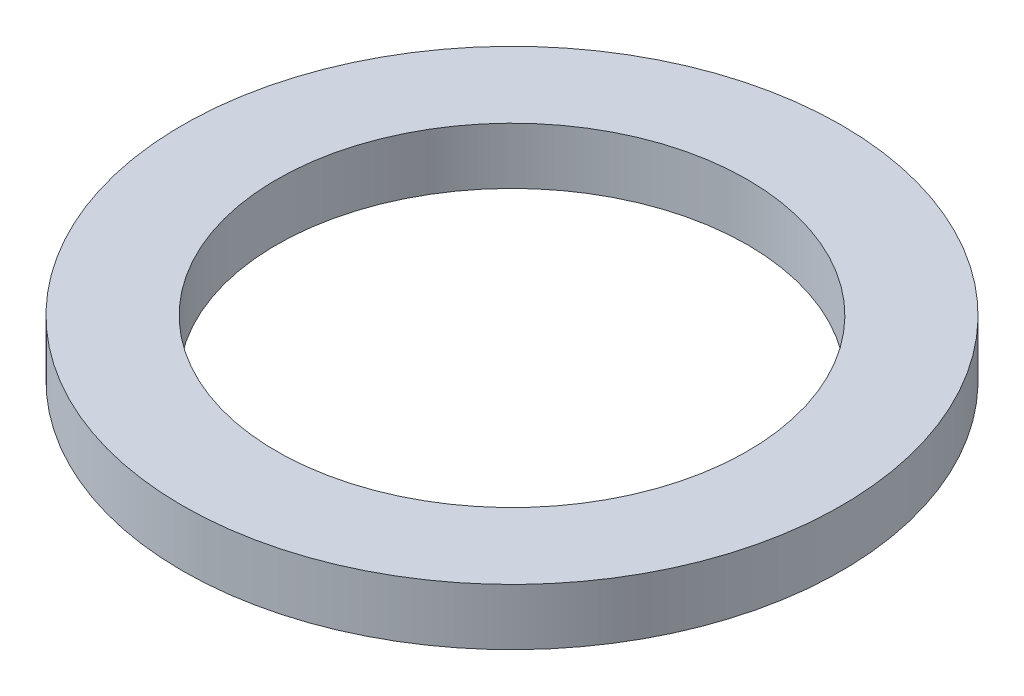
ISO-10303-21;
HEADER;
FILE_DESCRIPTION(('STEP AP214'),'2;1');
FILE_NAME('part.step','',(''),(''),'','','');
FILE_SCHEMA(('AUTOMOTIVE_DESIGN { 1 0 10303 214 1 1 1 1 }'));
ENDSEC;
DATA;
#1=APPLICATION_CONTEXT('core data for automotive mechanical design processes');
#2=APPLICATION_PROTOCOL_DEFINITION('international standard','automotive_design',2000,#1);
#3=PRODUCT_CONTEXT('',#1,'mechanical');
#4=PRODUCT('Part','Part','',(#3));
#5=PRODUCT_RELATED_PRODUCT_CATEGORY('part','',(#4));
#6=PRODUCT_DEFINITION_FORMATION('','',#4);
#7=PRODUCT_DEFINITION_CONTEXT('part definition',#1,'design');
#8=PRODUCT_DEFINITION('design','',#6,#7);
#9=PRODUCT_DEFINITION_SHAPE('','',#8);
#10=(LENGTH_UNIT() NAMED_UNIT(*) SI_UNIT(.MILLI.,.METRE.));
#11=(NAMED_UNIT(*) PLANE_ANGLE_UNIT() SI_UNIT($,.RADIAN.));
#12=(NAMED_UNIT(*) SI_UNIT($,.STERADIAN.) SOLID_ANGLE_UNIT());
#13=UNCERTAINTY_MEASURE_WITH_UNIT(LENGTH_MEASURE(1.E-05),#10,'distance_accuracy_value','');
#14=(GEOMETRIC_REPRESENTATION_CONTEXT(3) GLOBAL_UNCERTAINTY_ASSIGNED_CONTEXT((#13)) GLOBAL_UNIT_ASSIGNED_CONTEXT((#10,
#11,#12)) REPRESENTATION_CONTEXT('',''));
#15=CARTESIAN_POINT('',(0.,0.,0.));
#16=DIRECTION('',(0.,0.,1.));
#17=DIRECTION('',(1.,0.,0.));
#18=AXIS2_PLACEMENT_3D('',#15,#16,#17);
#19=CARTESIAN_POINT('',(0.,3.81,0.));
#20=DIRECTION('',(0.,1.,0.));
#21=DIRECTION('',(0.,0.,1.));
#22=AXIS2_PLACEMENT_3D('',#19,#20,#21);
#23=PLANE('',#22);
#24=CARTESIAN_POINT('',(0.,3.81,0.));
#25=DIRECTION('',(0.,1.,0.));
#26=DIRECTION('',(0.,0.,1.));
#27=AXIS2_PLACEMENT_3D('',#24,#25,#26);
#28=CIRCLE('',#27,22.225);
#29=CARTESIAN_POINT('',(0.,3.81,-22.225));
#30=VERTEX_POINT('',#29);
#31=EDGE_CURVE('E10',#30,#30,#28,.T.);
#32=ORIENTED_EDGE('',*,*,#31,.T.);
#33=EDGE_LOOP('',(#32));
#34=FACE_BOUND('',#33,.T.);
#35=CARTESIAN_POINT('',(0.,3.81,0.));
#36=DIRECTION('',(0.,1.,0.));
#37=DIRECTION('',(0.,0.,1.));
#38=AXIS2_PLACEMENT_3D('',#35,#36,#37);
#39=CIRCLE('',#38,15.875);
#40=CARTESIAN_POINT('',(0.,3.81,-15.875));
#41=VERTEX_POINT('',#40);
#42=EDGE_CURVE('E41',#41,#41,#39,.T.);
#43=ORIENTED_EDGE('',*,*,#42,.F.);
#44=EDGE_LOOP('',(#43));
#45=FACE_BOUND('',#44,.T.);
#46=ADVANCED_FACE('F30',(#34,#45),#23,.T.);
#47=CARTESIAN_POINT('',(0.,0.,0.));
#48=DIRECTION('',(0.,1.,0.));
#49=DIRECTION('',(0.,0.,1.));
#50=AXIS2_PLACEMENT_3D('',#47,#48,#49);
#51=PLANE('',#50);
#52=CARTESIAN_POINT('',(0.,0.,0.));
#53=DIRECTION('',(0.,1.,0.));
#54=DIRECTION('',(0.,0.,1.));
#55=AXIS2_PLACEMENT_3D('',#52,#53,#54);
#56=CIRCLE('',#55,22.225);
#57=CARTESIAN_POINT('',(0.,0.,-22.225));
#58=VERTEX_POINT('',#57);
#59=EDGE_CURVE('E34',#58,#58,#56,.T.);
#60=ORIENTED_EDGE('',*,*,#59,.F.);
#61=EDGE_LOOP('',(#60));
#62=FACE_BOUND('',#61,.T.);
#63=CARTESIAN_POINT('',(0.,0.,0.));
#64=DIRECTION('',(0.,1.,0.));
#65=DIRECTION('',(0.,0.,1.));
#66=AXIS2_PLACEMENT_3D('',#63,#64,#65);
#67=CIRCLE('',#66,15.875);
#68=CARTESIAN_POINT('',(0.,0.,-15.875));
#69=VERTEX_POINT('',#68);
#70=EDGE_CURVE('E43',#69,#69,#67,.T.);
#71=ORIENTED_EDGE('',*,*,#70,.T.);
#72=EDGE_LOOP('',(#71));
#73=FACE_BOUND('',#72,.T.);
#74=ADVANCED_FACE('F53',(#62,#73),#51,.F.);
#75=CARTESIAN_POINT('',(0.,3.81,0.));
#76=DIRECTION('',(0.,-1.,0.));
#77=DIRECTION('',(0.,0.,-1.));
#78=AXIS2_PLACEMENT_3D('',#75,#76,#77);
#79=CYLINDRICAL_SURFACE('',#78,22.225);
#80=CARTESIAN_POINT('',(0.,3.81,-22.225));
#81=CARTESIAN_POINT('',(0.,3.7703125,-22.225));
#82=CARTESIAN_POINT('',(0.,3.730625,-22.225));
#83=CARTESIAN_POINT('',(0.,3.65125,-22.225));
#84=CARTESIAN_POINT('',(0.,3.6115625,-22.225));
#85=CARTESIAN_POINT('',(0.,3.5321875,-22.225));
#86=CARTESIAN_POINT('',(0.,3.4925,-22.225));
#87=CARTESIAN_POINT('',(0.,3.413125,-22.225));
#88=CARTESIAN_POINT('',(0.,3.3734375,-22.225));
#89=CARTESIAN_POINT('',(0.,3.2940625,-22.225));
#90=CARTESIAN_POINT('',(0.,3.254375,-22.225));
#91=CARTESIAN_POINT('',(0.,3.175,-22.225));
#92=CARTESIAN_POINT('',(0.,3.1353125,-22.225));
#93=CARTESIAN_POINT('',(0.,3.0559375,-22.225));
#94=CARTESIAN_POINT('',(0.,3.01625,-22.225));
#95=CARTESIAN_POINT('',(0.,2.936875,-22.225));
#96=CARTESIAN_POINT('',(0.,2.8971875,-22.225));
#97=CARTESIAN_POINT('',(0.,2.8178125,-22.225));
#98=CARTESIAN_POINT('',(0.,2.778125,-22.225));
#99=CARTESIAN_POINT('',(0.,2.69875,-22.225));
#100=CARTESIAN_POINT('',(0.,2.6590625,-22.225));
#101=CARTESIAN_POINT('',(0.,2.5796875,-22.225));
#102=CARTESIAN_POINT('',(0.,2.54,-22.225));
#103=CARTESIAN_POINT('',(0.,2.460625,-22.225));
#104=CARTESIAN_POINT('',(0.,2.4209375,-22.225));
#105=CARTESIAN_POINT('',(0.,2.3415625,-22.225));
#106=CARTESIAN_POINT('',(0.,2.301875,-22.225));
#107=CARTESIAN_POINT('',(0.,2.2225,-22.225));
#108=CARTESIAN_POINT('',(0.,2.1828125,-22.225));
#109=CARTESIAN_POINT('',(0.,2.1034375,-22.225));
#110=CARTESIAN_POINT('',(0.,2.06375,-22.225));
#111=CARTESIAN_POINT('',(0.,1.984375,-22.225));
#112=CARTESIAN_POINT('',(0.,1.9446875,-22.225));
#113=CARTESIAN_POINT('',(0.,1.8653125,-22.225));
#114=CARTESIAN_POINT('',(0.,1.825625,-22.225));
#115=CARTESIAN_POINT('',(0.,1.74625,-22.225));
#116=CARTESIAN_POINT('',(0.,1.7065625,-22.225));
#117=CARTESIAN_POINT('',(0.,1.6271875,-22.225));
#118=CARTESIAN_POINT('',(0.,1.5875,-22.225));
#119=CARTESIAN_POINT('',(0.,1.508125,-22.225));
#120=CARTESIAN_POINT('',(0.,1.4684375,-22.225));
#121=CARTESIAN_POINT('',(0.,1.3890625,-22.225));
#122=CARTESIAN_POINT('',(0.,1.349375,-22.225));
#123=CARTESIAN_POINT('',(0.,1.27,-22.225));
#124=CARTESIAN_POINT('',(0.,1.2303125,-22.225));
#125=CARTESIAN_POINT('',(0.,1.1509375,-22.225));
#126=CARTESIAN_POINT('',(0.,1.11125,-22.225));
#127=CARTESIAN_POINT('',(0.,1.031875,-22.225));
#128=CARTESIAN_POINT('',(0.,0.9921875,-22.225));
#129=CARTESIAN_POINT('',(0.,0.9128125,-22.225));
#130=CARTESIAN_POINT('',(0.,0.873125,-22.225));
#131=CARTESIAN_POINT('',(0.,0.79375,-22.225));
#132=CARTESIAN_POINT('',(0.,0.7540625,-22.225));
#133=CARTESIAN_POINT('',(0.,0.6746875,-22.225));
#134=CARTESIAN_POINT('',(0.,0.635,-22.225));
#135=CARTESIAN_POINT('',(0.,0.555625,-22.225));
#136=CARTESIAN_POINT('',(0.,0.5159375,-22.225));
#137=CARTESIAN_POINT('',(0.,0.4365625,-22.225));
#138=CARTESIAN_POINT('',(0.,0.396875,-22.225));
#139=CARTESIAN_POINT('',(0.,0.3175,-22.225));
#140=CARTESIAN_POINT('',(0.,0.2778125,-22.225));
#141=CARTESIAN_POINT('',(0.,0.1984375,-22.225));
#142=CARTESIAN_POINT('',(0.,0.15875,-22.225));
#143=CARTESIAN_POINT('',(0.,0.0793749999999999,-22.225));
#144=CARTESIAN_POINT('',(0.,0.0396874999999999,-22.225));
#145=CARTESIAN_POINT('',(0.,0.,-22.225));
#146=B_SPLINE_CURVE_WITH_KNOTS('',3,(#80,#81,#82,#83,#84,#85,#86,#87,#88,#89,#90,#91,#92,#93,
#94,#95,#96,#97,#98,#99,#100,#101,#102,#103,#104,#105,#106,#107,#108,#109,#110,#111,#112,#113,
#114,#115,#116,#117,#118,#119,#120,#121,#122,#123,#124,#125,#126,#127,#128,#129,#130,#131,#132,
#133,#134,#135,#136,#137,#138,#139,#140,#141,#142,#143,#144,#145),.UNSPECIFIED.,.F.,.F.,(4,2,2,
2,2,2,2,2,2,2,2,2,2,2,2,2,2,2,2,2,2,2,2,2,2,2,2,2,2,2,2,2,4),(0.,0.1190625,0.238125,0.3571875,
0.47625,0.595312499999999,0.714375,0.833437499999999,0.952499999999999,1.0715625,1.190625,
1.3096875,1.42875,1.5478125,1.666875,1.7859375,1.905,2.0240625,2.143125,2.2621875,2.38125,
2.5003125,2.619375,2.7384375,2.8575,2.9765625,3.095625,3.2146875,3.33375,3.4528125,3.571875,
3.6909375,3.81),.UNSPECIFIED.);
#147=EDGE_CURVE('BSEAM32',#30,#58,#146,.T.);
#148=ORIENTED_EDGE('',*,*,#31,.F.);
#149=ORIENTED_EDGE('',*,*,#59,.T.);
#150=ORIENTED_EDGE('',*,*,#147,.T.);
#151=ORIENTED_EDGE('',*,*,#147,.F.);
#152=EDGE_LOOP('',(#148,#150,#149,#151));
#153=FACE_BOUND('',#152,.T.);
#154=ADVANCED_FACE('F32',(#153),#79,.T.);
#155=CARTESIAN_POINT('',(0.,3.81,0.));
#156=DIRECTION('',(0.,-1.,0.));
#157=DIRECTION('',(0.,0.,-1.));
#158=AXIS2_PLACEMENT_3D('',#155,#156,#157);
#159=CYLINDRICAL_SURFACE('',#158,15.875);
#160=CARTESIAN_POINT('',(0.,3.81,-15.875));
#161=CARTESIAN_POINT('',(0.,3.7703125,-15.875));
#162=CARTESIAN_POINT('',(0.,3.730625,-15.875));
#163=CARTESIAN_POINT('',(0.,3.65125,-15.875));
#164=CARTESIAN_POINT('',(0.,3.6115625,-15.875));
#165=CARTESIAN_POINT('',(0.,3.5321875,-15.875));
#166=CARTESIAN_POINT('',(0.,3.4925,-15.875));
#167=CARTESIAN_POINT('',(0.,3.413125,-15.875));
#168=CARTESIAN_POINT('',(0.,3.3734375,-15.875));
#169=CARTESIAN_POINT('',(0.,3.2940625,-15.875));
#170=CARTESIAN_POINT('',(0.,3.254375,-15.875));
#171=CARTESIAN_POINT('',(0.,3.175,-15.875));
#172=CARTESIAN_POINT('',(0.,3.1353125,-15.875));
#173=CARTESIAN_POINT('',(0.,3.0559375,-15.875));
#174=CARTESIAN_POINT('',(0.,3.01625,-15.875));
#175=CARTESIAN_POINT('',(0.,2.936875,-15.875));
#176=CARTESIAN_POINT('',(0.,2.8971875,-15.875));
#177=CARTESIAN_POINT('',(0.,2.8178125,-15.875));
#178=CARTESIAN_POINT('',(0.,2.778125,-15.875));
#179=CARTESIAN_POINT('',(0.,2.69875,-15.875));
#180=CARTESIAN_POINT('',(0.,2.6590625,-15.875));
#181=CARTESIAN_POINT('',(0.,2.5796875,-15.875));
#182=CARTESIAN_POINT('',(0.,2.54,-15.875));
#183=CARTESIAN_POINT('',(0.,2.460625,-15.875));
#184=CARTESIAN_POINT('',(0.,2.4209375,-15.875));
#185=CARTESIAN_POINT('',(0.,2.3415625,-15.875));
#186=CARTESIAN_POINT('',(0.,2.301875,-15.875));
#187=CARTESIAN_POINT('',(0.,2.2225,-15.875));
#188=CARTESIAN_POINT('',(0.,2.1828125,-15.875));
#189=CARTESIAN_POINT('',(0.,2.1034375,-15.875));
#190=CARTESIAN_POINT('',(0.,2.06375,-15.875));
#191=CARTESIAN_POINT('',(0.,1.984375,-15.875));
#192=CARTESIAN_POINT('',(0.,1.9446875,-15.875));
#193=CARTESIAN_POINT('',(0.,1.8653125,-15.875));
#194=CARTESIAN_POINT('',(0.,1.825625,-15.875));
#195=CARTESIAN_POINT('',(0.,1.74625,-15.875));
#196=CARTESIAN_POINT('',(0.,1.7065625,-15.875));
#197=CARTESIAN_POINT('',(0.,1.6271875,-15.875));
#198=CARTESIAN_POINT('',(0.,1.5875,-15.875));
#199=CARTESIAN_POINT('',(0.,1.508125,-15.875));
#200=CARTESIAN_POINT('',(0.,1.4684375,-15.875));
#201=CARTESIAN_POINT('',(0.,1.3890625,-15.875));
#202=CARTESIAN_POINT('',(0.,1.349375,-15.875));
#203=CARTESIAN_POINT('',(0.,1.27,-15.875));
#204=CARTESIAN_POINT('',(0.,1.2303125,-15.875));
#205=CARTESIAN_POINT('',(0.,1.1509375,-15.875));
#206=CARTESIAN_POINT('',(0.,1.11125,-15.875));
#207=CARTESIAN_POINT('',(0.,1.031875,-15.875));
#208=CARTESIAN_POINT('',(0.,0.9921875,-15.875));
#209=CARTESIAN_POINT('',(0.,0.9128125,-15.875));
#210=CARTESIAN_POINT('',(0.,0.873125,-15.875));
#211=CARTESIAN_POINT('',(0.,0.79375,-15.875));
#212=CARTESIAN_POINT('',(0.,0.7540625,-15.875));
#213=CARTESIAN_POINT('',(0.,0.6746875,-15.875));
#214=CARTESIAN_POINT('',(0.,0.635,-15.875));
#215=CARTESIAN_POINT('',(0.,0.555625,-15.875));
#216=CARTESIAN_POINT('',(0.,0.5159375,-15.875));
#217=CARTESIAN_POINT('',(0.,0.4365625,-15.875));
#218=CARTESIAN_POINT('',(0.,0.396875,-15.875));
#219=CARTESIAN_POINT('',(0.,0.3175,-15.875));
#220=CARTESIAN_POINT('',(0.,0.2778125,-15.875));
#221=CARTESIAN_POINT('',(0.,0.1984375,-15.875));
#222=CARTESIAN_POINT('',(0.,0.15875,-15.875));
#223=CARTESIAN_POINT('',(0.,0.0793749999999999,-15.875));
#224=CARTESIAN_POINT('',(0.,0.0396874999999999,-15.875));
#225=CARTESIAN_POINT('',(0.,0.,-15.875));
#226=B_SPLINE_CURVE_WITH_KNOTS('',3,(#160,#161,#162,#163,#164,#165,#166,#167,#168,#169,#170,
#171,#172,#173,#174,#175,#176,#177,#178,#179,#180,#181,#182,#183,#184,#185,#186,#187,#188,#189,
#190,#191,#192,#193,#194,#195,#196,#197,#198,#199,#200,#201,#202,#203,#204,#205,#206,#207,#208,
#209,#210,#211,#212,#213,#214,#215,#216,#217,#218,#219,#220,#221,#222,#223,#224,#225),
.UNSPECIFIED.,.F.,.F.,(4,2,2,2,2,2,2,2,2,2,2,2,2,2,2,2,2,2,2,2,2,2,2,2,2,2,2,2,2,2,2,2,4),(0.,
0.1190625,0.238125,0.3571875,0.47625,0.5953125,0.714375,0.8334375,0.9525,1.0715625,1.190625,
1.3096875,1.42875,1.5478125,1.666875,1.7859375,1.905,2.0240625,2.143125,2.2621875,2.38125,
2.5003125,2.619375,2.7384375,2.8575,2.9765625,3.095625,3.2146875,3.33375,3.4528125,3.571875,
3.6909375,3.81),.UNSPECIFIED.);
#227=EDGE_CURVE('BSEAM49',#41,#69,#226,.T.);
#228=ORIENTED_EDGE('',*,*,#42,.T.);
#229=ORIENTED_EDGE('',*,*,#70,.F.);
#230=ORIENTED_EDGE('',*,*,#227,.T.);
#231=ORIENTED_EDGE('',*,*,#227,.F.);
#232=EDGE_LOOP('',(#228,#230,#229,#231));
#233=FACE_BOUND('',#232,.T.);
#234=ADVANCED_FACE('F49',(#233),#159,.F.);
#235=CLOSED_SHELL('',(#46,#74,#154,#234));
#236=MANIFOLD_SOLID_BREP('B2',#235);
#237=ADVANCED_BREP_SHAPE_REPRESENTATION('',(#18,#236),#14);
#238=SHAPE_DEFINITION_REPRESENTATION(#9,#237);
ENDSEC;
END-ISO-10303-21;
